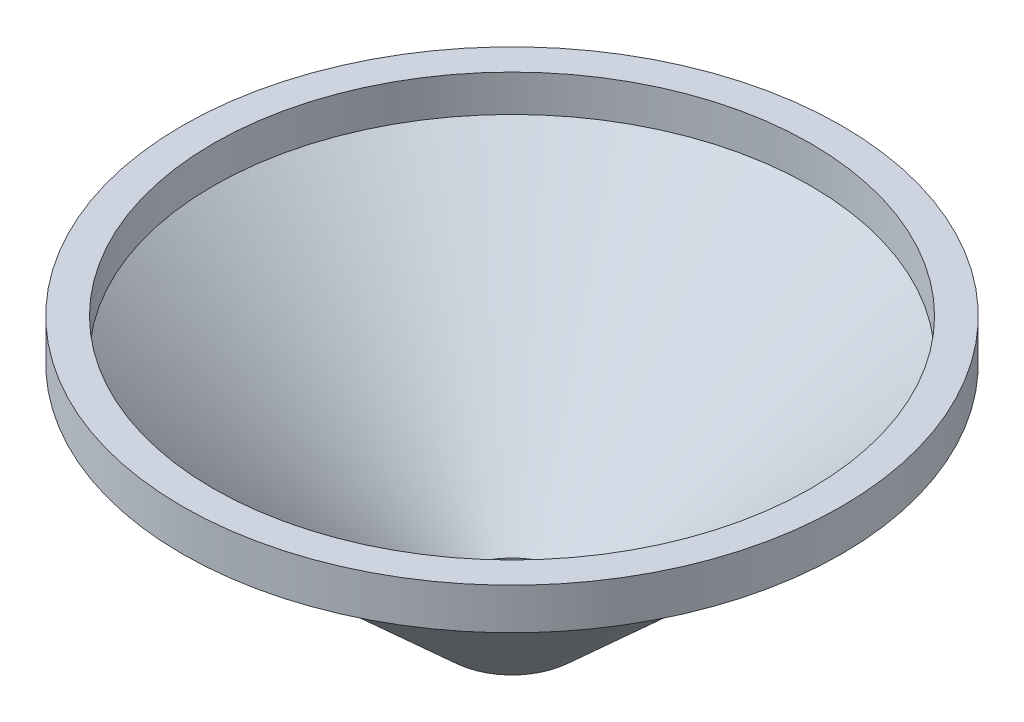
ISO-10303-21;
HEADER;
FILE_DESCRIPTION(('STEP AP214'),'2;1');
FILE_NAME('part.step','',(''),(''),'','','');
FILE_SCHEMA(('AUTOMOTIVE_DESIGN { 1 0 10303 214 1 1 1 1 }'));
ENDSEC;
DATA;
#1=APPLICATION_CONTEXT('core data for automotive mechanical design processes');
#2=APPLICATION_PROTOCOL_DEFINITION('international standard','automotive_design',2000,#1);
#3=PRODUCT_CONTEXT('',#1,'mechanical');
#4=PRODUCT('Part','Part','',(#3));
#5=PRODUCT_RELATED_PRODUCT_CATEGORY('part','',(#4));
#6=PRODUCT_DEFINITION_FORMATION('','',#4);
#7=PRODUCT_DEFINITION_CONTEXT('part definition',#1,'design');
#8=PRODUCT_DEFINITION('design','',#6,#7);
#9=PRODUCT_DEFINITION_SHAPE('','',#8);
#10=(LENGTH_UNIT() NAMED_UNIT(*) SI_UNIT(.MILLI.,.METRE.));
#11=(NAMED_UNIT(*) PLANE_ANGLE_UNIT() SI_UNIT($,.RADIAN.));
#12=(NAMED_UNIT(*) SI_UNIT($,.STERADIAN.) SOLID_ANGLE_UNIT());
#13=UNCERTAINTY_MEASURE_WITH_UNIT(LENGTH_MEASURE(1.E-05),#10,'distance_accuracy_value','');
#14=(GEOMETRIC_REPRESENTATION_CONTEXT(3) GLOBAL_UNCERTAINTY_ASSIGNED_CONTEXT((#13)) GLOBAL_UNIT_ASSIGNED_CONTEXT((#10,
#11,#12)) REPRESENTATION_CONTEXT('',''));
#15=CARTESIAN_POINT('',(0.,0.,0.));
#16=DIRECTION('',(0.,0.,1.));
#17=DIRECTION('',(1.,0.,0.));
#18=AXIS2_PLACEMENT_3D('',#15,#16,#17);
#19=CARTESIAN_POINT('',(14.5,0.,0.));
#20=DIRECTION('',(0.,1.,0.));
#21=DIRECTION('',(0.,0.,1.));
#22=AXIS2_PLACEMENT_3D('',#19,#20,#21);
#23=PLANE('',#22);
#24=CARTESIAN_POINT('',(0.,0.,0.));
#25=DIRECTION('',(0.,1.,0.));
#26=DIRECTION('',(0.,0.,1.));
#27=AXIS2_PLACEMENT_3D('',#24,#25,#26);
#28=CIRCLE('',#27,14.5);
#29=CARTESIAN_POINT('',(0.,0.,14.5));
#30=VERTEX_POINT('',#29);
#31=EDGE_CURVE('E41',#30,#30,#28,.T.);
#32=ORIENTED_EDGE('',*,*,#31,.F.);
#33=EDGE_LOOP('',(#32));
#34=FACE_BOUND('',#33,.T.);
#35=CARTESIAN_POINT('',(0.,0.,0.));
#36=DIRECTION('',(0.,1.,0.));
#37=DIRECTION('',(0.,0.,1.));
#38=AXIS2_PLACEMENT_3D('',#35,#36,#37);
#39=CIRCLE('',#38,16.);
#40=CARTESIAN_POINT('',(0.,0.,16.));
#41=VERTEX_POINT('',#40);
#42=EDGE_CURVE('E53',#41,#41,#39,.T.);
#43=ORIENTED_EDGE('',*,*,#42,.T.);
#44=EDGE_LOOP('',(#43));
#45=FACE_BOUND('',#44,.T.);
#46=ADVANCED_FACE('F33',(#34,#45),#23,.T.);
#47=CARTESIAN_POINT('',(0.,0.,0.));
#48=DIRECTION('',(0.,1.,0.));
#49=DIRECTION('',(0.,0.,1.));
#50=AXIS2_PLACEMENT_3D('',#47,#48,#49);
#51=CYLINDRICAL_SURFACE('',#50,14.5);
#52=CARTESIAN_POINT('',(0.,-1.7796105291498,0.));
#53=DIRECTION('',(0.,1.,0.));
#54=DIRECTION('',(0.,0.,1.));
#55=AXIS2_PLACEMENT_3D('',#52,#53,#54);
#56=CIRCLE('',#55,14.5);
#57=CARTESIAN_POINT('',(0.,-1.7796105291498,14.5));
#58=VERTEX_POINT('',#57);
#59=EDGE_CURVE('E45',#58,#58,#56,.T.);
#60=ORIENTED_EDGE('',*,*,#59,.F.);
#61=EDGE_LOOP('',(#60));
#62=FACE_BOUND('',#61,.T.);
#63=ORIENTED_EDGE('',*,*,#31,.T.);
#64=EDGE_LOOP('',(#63));
#65=FACE_BOUND('',#64,.T.);
#66=ADVANCED_FACE('F78',(#62,#65),#51,.F.);
#67=CARTESIAN_POINT('',(0.,-1.7796105291498,0.));
#68=DIRECTION('',(0.,1.,0.));
#69=DIRECTION('',(0.,0.,1.));
#70=AXIS2_PLACEMENT_3D('',#67,#68,#69);
#71=CONICAL_SURFACE('',#70,14.5,0.830318571532458);
#72=CARTESIAN_POINT('',(0.,-12.2902194260044,0.));
#73=DIRECTION('',(0.,1.,0.));
#74=DIRECTION('',(0.,0.,1.));
#75=AXIS2_PLACEMENT_3D('',#72,#73,#74);
#76=CIRCLE('',#75,3.);
#77=CARTESIAN_POINT('',(0.,-12.2902194260044,3.));
#78=VERTEX_POINT('',#77);
#79=EDGE_CURVE('E56',#78,#78,#76,.F.);
#80=CARTESIAN_POINT('',(0.,-12.2902194260044,3.));
#81=CARTESIAN_POINT('',(0.,-12.1807339166621,3.11979166666667));
#82=CARTESIAN_POINT('',(0.,-12.0712484073199,3.23958333333333));
#83=CARTESIAN_POINT('',(0.,-11.8522773886354,3.47916666666667));
#84=CARTESIAN_POINT('',(0.,-11.7427918792932,3.59895833333333));
#85=CARTESIAN_POINT('',(0.,-11.5238208606087,3.83854166666667));
#86=CARTESIAN_POINT('',(0.,-11.4143353512665,3.95833333333333));
#87=CARTESIAN_POINT('',(0.,-11.195364332582,4.19791666666667));
#88=CARTESIAN_POINT('',(0.,-11.0858788232398,4.31770833333333));
#89=CARTESIAN_POINT('',(0.,-10.8669078045553,4.55729166666667));
#90=CARTESIAN_POINT('',(0.,-10.7574222952131,4.67708333333333));
#91=CARTESIAN_POINT('',(0.,-10.5384512765286,4.91666666666667));
#92=CARTESIAN_POINT('',(0.,-10.4289657671864,5.03645833333333));
#93=CARTESIAN_POINT('',(0.,-10.2099947485019,5.27604166666667));
#94=CARTESIAN_POINT('',(0.,-10.1005092391597,5.39583333333333));
#95=CARTESIAN_POINT('',(0.,-9.88153822047519,5.63541666666667));
#96=CARTESIAN_POINT('',(0.,-9.77205271113296,5.75520833333333));
#97=CARTESIAN_POINT('',(0.,-9.55308169244849,5.99479166666667));
#98=CARTESIAN_POINT('',(0.,-9.44359618310625,6.11458333333333));
#99=CARTESIAN_POINT('',(0.,-9.22462516442178,6.35416666666667));
#100=CARTESIAN_POINT('',(0.,-9.11513965507955,6.47395833333333));
#101=CARTESIAN_POINT('',(0.,-8.89616863639508,6.71354166666667));
#102=CARTESIAN_POINT('',(0.,-8.78668312705284,6.83333333333333));
#103=CARTESIAN_POINT('',(0.,-8.56771210836837,7.07291666666667));
#104=CARTESIAN_POINT('',(0.,-8.45822659902614,7.19270833333333));
#105=CARTESIAN_POINT('',(0.,-8.23925558034167,7.43229166666667));
#106=CARTESIAN_POINT('',(0.,-8.12977007099943,7.55208333333333));
#107=CARTESIAN_POINT('',(0.,-7.91079905231496,7.79166666666667));
#108=CARTESIAN_POINT('',(0.,-7.80131354297273,7.91145833333333));
#109=CARTESIAN_POINT('',(0.,-7.58234252428826,8.15104166666667));
#110=CARTESIAN_POINT('',(0.,-7.47285701494602,8.27083333333333));
#111=CARTESIAN_POINT('',(0.,-7.25388599626155,8.51041666666667));
#112=CARTESIAN_POINT('',(0.,-7.14440048691932,8.63020833333333));
#113=CARTESIAN_POINT('',(0.,-6.92542946823485,8.86979166666667));
#114=CARTESIAN_POINT('',(0.,-6.81594395889261,8.98958333333333));
#115=CARTESIAN_POINT('',(0.,-6.59697294020814,9.22916666666667));
#116=CARTESIAN_POINT('',(0.,-6.4874874308659,9.34895833333333));
#117=CARTESIAN_POINT('',(0.,-6.26851641218144,9.58854166666667));
#118=CARTESIAN_POINT('',(0.,-6.1590309028392,9.70833333333333));
#119=CARTESIAN_POINT('',(0.,-5.94005988415473,9.94791666666667));
#120=CARTESIAN_POINT('',(0.,-5.83057437481249,10.0677083333333));
#121=CARTESIAN_POINT('',(0.,-5.61160335612802,10.3072916666667));
#122=CARTESIAN_POINT('',(0.,-5.50211784678579,10.4270833333333));
#123=CARTESIAN_POINT('',(0.,-5.28314682810132,10.6666666666667));
#124=CARTESIAN_POINT('',(0.,-5.17366131875908,10.7864583333333));
#125=CARTESIAN_POINT('',(0.,-4.95469030007461,11.0260416666667));
#126=CARTESIAN_POINT('',(0.,-4.84520479073238,11.1458333333333));
#127=CARTESIAN_POINT('',(0.,-4.62623377204791,11.3854166666667));
#128=CARTESIAN_POINT('',(0.,-4.51674826270567,11.5052083333333));
#129=CARTESIAN_POINT('',(0.,-4.2977772440212,11.7447916666667));
#130=CARTESIAN_POINT('',(0.,-4.18829173467897,11.8645833333333));
#131=CARTESIAN_POINT('',(0.,-3.9693207159945,12.1041666666667));
#132=CARTESIAN_POINT('',(0.,-3.85983520665226,12.2239583333333));
#133=CARTESIAN_POINT('',(0.,-3.64086418796779,12.4635416666667));
#134=CARTESIAN_POINT('',(0.,-3.53137867862556,12.5833333333333));
#135=CARTESIAN_POINT('',(0.,-3.31240765994109,12.8229166666667));
#136=CARTESIAN_POINT('',(0.,-3.20292215059885,12.9427083333333));
#137=CARTESIAN_POINT('',(0.,-2.98395113191438,13.1822916666667));
#138=CARTESIAN_POINT('',(0.,-2.87446562257215,13.3020833333333));
#139=CARTESIAN_POINT('',(0.,-2.65549460388768,13.5416666666667));
#140=CARTESIAN_POINT('',(0.,-2.54600909454544,13.6614583333333));
#141=CARTESIAN_POINT('',(0.,-2.32703807586097,13.9010416666667));
#142=CARTESIAN_POINT('',(0.,-2.21755256651874,14.0208333333333));
#143=CARTESIAN_POINT('',(0.,-1.99858154783427,14.2604166666667));
#144=CARTESIAN_POINT('',(0.,-1.88909603849203,14.3802083333333));
#145=CARTESIAN_POINT('',(0.,-1.7796105291498,14.5));
#146=B_SPLINE_CURVE_WITH_KNOTS('',3,(#80,#81,#82,#83,#84,#85,#86,#87,#88,#89,#90,#91,#92,#93,
#94,#95,#96,#97,#98,#99,#100,#101,#102,#103,#104,#105,#106,#107,#108,#109,#110,#111,#112,#113,
#114,#115,#116,#117,#118,#119,#120,#121,#122,#123,#124,#125,#126,#127,#128,#129,#130,#131,#132,
#133,#134,#135,#136,#137,#138,#139,#140,#141,#142,#143,#144,#145),.UNSPECIFIED.,.F.,.F.,(4,2,2,
2,2,2,2,2,2,2,2,2,2,2,2,2,2,2,2,2,2,2,2,2,2,2,2,2,2,2,2,2,4),(0.,0.486861460200289,
0.973722920400578,1.46058438060087,1.94744584080116,2.43430730100145,2.92116876120173,
3.40803022140202,3.89489168160231,4.3817531418026,4.86861460200289,5.35547606220318,
5.84233752240347,6.32919898260376,6.81606044280405,7.30292190300434,7.78978336320463,
8.27664482340492,8.76350628360521,9.2503677438055,9.73722920400578,10.2240906642061,
10.7109521244064,11.1978135846067,11.6846750448069,12.1715365050072,12.6583979652075,
13.1452594254078,13.6321208856081,14.1189823458084,14.6058438060087,15.092705266209,
15.5795667264093),.UNSPECIFIED.);
#147=EDGE_CURVE('BSEAM83',#78,#58,#146,.T.);
#148=ORIENTED_EDGE('',*,*,#79,.T.);
#149=ORIENTED_EDGE('',*,*,#59,.T.);
#150=ORIENTED_EDGE('',*,*,#147,.T.);
#151=ORIENTED_EDGE('',*,*,#147,.F.);
#152=EDGE_LOOP('',(#148,#150,#149,#151));
#153=FACE_BOUND('',#152,.T.);
#154=ADVANCED_FACE('F83',(#153),#71,.F.);
#155=CARTESIAN_POINT('',(-15.,-2.,0.));
#156=DIRECTION('',(0.,-1.,0.));
#157=DIRECTION('',(0.,0.,-1.));
#158=AXIS2_PLACEMENT_3D('',#155,#156,#157);
#159=PLANE('',#158);
#160=CARTESIAN_POINT('',(0.,-2.,0.));
#161=DIRECTION('',(0.,1.,0.));
#162=DIRECTION('',(0.,0.,1.));
#163=AXIS2_PLACEMENT_3D('',#160,#161,#162);
#164=CIRCLE('',#163,15.);
#165=CARTESIAN_POINT('',(0.,-2.,15.));
#166=VERTEX_POINT('',#165);
#167=EDGE_CURVE('E10',#166,#166,#164,.T.);
#168=ORIENTED_EDGE('',*,*,#167,.T.);
#169=EDGE_LOOP('',(#168));
#170=FACE_BOUND('',#169,.T.);
#171=CARTESIAN_POINT('',(0.,-2.,0.));
#172=DIRECTION('',(0.,1.,0.));
#173=DIRECTION('',(0.,0.,1.));
#174=AXIS2_PLACEMENT_3D('',#171,#172,#173);
#175=CIRCLE('',#174,16.);
#176=CARTESIAN_POINT('',(0.,-2.,16.));
#177=VERTEX_POINT('',#176);
#178=EDGE_CURVE('E50',#177,#177,#175,.T.);
#179=ORIENTED_EDGE('',*,*,#178,.F.);
#180=EDGE_LOOP('',(#179));
#181=FACE_BOUND('',#180,.T.);
#182=ADVANCED_FACE('F74',(#170,#181),#159,.T.);
#183=CARTESIAN_POINT('',(0.,0.,0.));
#184=DIRECTION('',(0.,1.,0.));
#185=DIRECTION('',(0.,0.,1.));
#186=AXIS2_PLACEMENT_3D('',#183,#184,#185);
#187=CYLINDRICAL_SURFACE('',#186,16.);
#188=ORIENTED_EDGE('',*,*,#178,.T.);
#189=EDGE_LOOP('',(#188));
#190=FACE_BOUND('',#189,.T.);
#191=ORIENTED_EDGE('',*,*,#42,.F.);
#192=EDGE_LOOP('',(#191));
#193=FACE_BOUND('',#192,.T.);
#194=ADVANCED_FACE('F68',(#190,#193),#187,.T.);
#195=CARTESIAN_POINT('',(0.,-2.,0.));
#196=DIRECTION('',(0.,1.,0.));
#197=DIRECTION('',(0.,0.,1.));
#198=AXIS2_PLACEMENT_3D('',#195,#196,#197);
#199=CONICAL_SURFACE('',#198,15.,0.830318571532458);
#200=CARTESIAN_POINT('',(0.,-12.96759189237,0.));
#201=DIRECTION('',(0.,1.,0.));
#202=DIRECTION('',(0.,0.,1.));
#203=AXIS2_PLACEMENT_3D('',#200,#201,#202);
#204=CIRCLE('',#203,3.);
#205=CARTESIAN_POINT('',(0.,-12.96759189237,3.));
#206=VERTEX_POINT('',#205);
#207=EDGE_CURVE('E37',#206,#206,#204,.F.);
#208=CARTESIAN_POINT('',(0.,-12.96759189237,3.));
#209=CARTESIAN_POINT('',(0.,-12.8533461434911,3.125));
#210=CARTESIAN_POINT('',(0.,-12.7391003946123,3.25));
#211=CARTESIAN_POINT('',(0.,-12.5106088968546,3.5));
#212=CARTESIAN_POINT('',(0.,-12.3963631479757,3.625));
#213=CARTESIAN_POINT('',(0.,-12.167871650218,3.875));
#214=CARTESIAN_POINT('',(0.,-12.0536259013391,4.));
#215=CARTESIAN_POINT('',(0.,-11.8251344035814,4.25));
#216=CARTESIAN_POINT('',(0.,-11.7108886547026,4.375));
#217=CARTESIAN_POINT('',(0.,-11.4823971569449,4.625));
#218=CARTESIAN_POINT('',(0.,-11.368151408066,4.75));
#219=CARTESIAN_POINT('',(0.,-11.1396599103083,5.));
#220=CARTESIAN_POINT('',(0.,-11.0254141614295,5.125));
#221=CARTESIAN_POINT('',(0.,-10.7969226636718,5.375));
#222=CARTESIAN_POINT('',(0.,-10.6826769147929,5.5));
#223=CARTESIAN_POINT('',(0.,-10.4541854170352,5.75));
#224=CARTESIAN_POINT('',(0.,-10.3399396681563,5.875));
#225=CARTESIAN_POINT('',(0.,-10.1114481703986,6.125));
#226=CARTESIAN_POINT('',(0.,-9.99720242151978,6.25));
#227=CARTESIAN_POINT('',(0.,-9.76871092376207,6.5));
#228=CARTESIAN_POINT('',(0.,-9.65446517488321,6.625));
#229=CARTESIAN_POINT('',(0.,-9.4259736771255,6.875));
#230=CARTESIAN_POINT('',(0.,-9.31172792824665,7.));
#231=CARTESIAN_POINT('',(0.,-9.08323643048895,7.25));
#232=CARTESIAN_POINT('',(0.,-8.96899068161009,7.375));
#233=CARTESIAN_POINT('',(0.,-8.74049918385238,7.625));
#234=CARTESIAN_POINT('',(0.,-8.62625343497353,7.75));
#235=CARTESIAN_POINT('',(0.,-8.39776193721582,8.));
#236=CARTESIAN_POINT('',(0.,-8.28351618833697,8.125));
#237=CARTESIAN_POINT('',(0.,-8.05502469057926,8.375));
#238=CARTESIAN_POINT('',(0.,-7.9407789417004,8.5));
#239=CARTESIAN_POINT('',(0.,-7.7122874439427,8.75));
#240=CARTESIAN_POINT('',(0.,-7.59804169506384,8.875));
#241=CARTESIAN_POINT('',(0.,-7.36955019730614,9.125));
#242=CARTESIAN_POINT('',(0.,-7.25530444842728,9.25));
#243=CARTESIAN_POINT('',(0.,-7.02681295066957,9.5));
#244=CARTESIAN_POINT('',(0.,-6.91256720179072,9.625));
#245=CARTESIAN_POINT('',(0.,-6.68407570403301,9.875));
#246=CARTESIAN_POINT('',(0.,-6.56982995515416,10.));
#247=CARTESIAN_POINT('',(0.,-6.34133845739645,10.25));
#248=CARTESIAN_POINT('',(0.,-6.2270927085176,10.375));
#249=CARTESIAN_POINT('',(0.,-5.99860121075989,10.625));
#250=CARTESIAN_POINT('',(0.,-5.88435546188103,10.75));
#251=CARTESIAN_POINT('',(0.,-5.65586396412333,11.));
#252=CARTESIAN_POINT('',(0.,-5.54161821524447,11.125));
#253=CARTESIAN_POINT('',(0.,-5.31312671748676,11.375));
#254=CARTESIAN_POINT('',(0.,-5.19888096860791,11.5));
#255=CARTESIAN_POINT('',(0.,-4.9703894708502,11.75));
#256=CARTESIAN_POINT('',(0.,-4.85614372197135,11.875));
#257=CARTESIAN_POINT('',(0.,-4.62765222421364,12.125));
#258=CARTESIAN_POINT('',(0.,-4.51340647533479,12.25));
#259=CARTESIAN_POINT('',(0.,-4.28491497757708,12.5));
#260=CARTESIAN_POINT('',(0.,-4.17066922869822,12.625));
#261=CARTESIAN_POINT('',(0.,-3.94217773094052,12.875));
#262=CARTESIAN_POINT('',(0.,-3.82793198206166,13.));
#263=CARTESIAN_POINT('',(0.,-3.59944048430396,13.25));
#264=CARTESIAN_POINT('',(0.,-3.4851947354251,13.375));
#265=CARTESIAN_POINT('',(0.,-3.25670323766739,13.625));
#266=CARTESIAN_POINT('',(0.,-3.14245748878854,13.75));
#267=CARTESIAN_POINT('',(0.,-2.91396599103083,14.));
#268=CARTESIAN_POINT('',(0.,-2.79972024215198,14.125));
#269=CARTESIAN_POINT('',(0.,-2.57122874439427,14.375));
#270=CARTESIAN_POINT('',(0.,-2.45698299551542,14.5));
#271=CARTESIAN_POINT('',(0.,-2.22849149775771,14.75));
#272=CARTESIAN_POINT('',(0.,-2.11424574887885,14.875));
#273=CARTESIAN_POINT('',(0.,-2.,15.));
#274=B_SPLINE_CURVE_WITH_KNOTS('',3,(#208,#209,#210,#211,#212,#213,#214,#215,#216,#217,#218,
#219,#220,#221,#222,#223,#224,#225,#226,#227,#228,#229,#230,#231,#232,#233,#234,#235,#236,#237,
#238,#239,#240,#241,#242,#243,#244,#245,#246,#247,#248,#249,#250,#251,#252,#253,#254,#255,#256,
#257,#258,#259,#260,#261,#262,#263,#264,#265,#266,#267,#268,#269,#270,#271,#272,#273),
.UNSPECIFIED.,.F.,.F.,(4,2,2,2,2,2,2,2,2,2,2,2,2,2,2,2,2,2,2,2,2,2,2,2,2,2,2,2,2,2,2,2,4),(0.,
0.508029349774213,1.01605869954843,1.52408804932264,2.03211739909686,2.54014674887107,
3.04817609864529,3.5562054484195,4.06423479819372,4.57226414796793,5.08029349774215,
5.58832284751636,6.09635219729058,6.60438154706479,7.11241089683901,7.62044024661322,
8.12846959638744,8.63649894616165,9.14452829593587,9.65255764571008,10.1605869954843,
10.6686163452585,11.1766456950327,11.6846750448069,12.1927043945812,12.7007337443554,
13.2087630941296,13.7167924439038,14.224821793678,14.7328511434522,15.2408804932264,
15.7489098430007,16.2569391927749),.UNSPECIFIED.);
#275=EDGE_CURVE('BSEAM35',#206,#166,#274,.T.);
#276=ORIENTED_EDGE('',*,*,#207,.F.);
#277=ORIENTED_EDGE('',*,*,#167,.F.);
#278=ORIENTED_EDGE('',*,*,#275,.T.);
#279=ORIENTED_EDGE('',*,*,#275,.F.);
#280=EDGE_LOOP('',(#276,#278,#277,#279));
#281=FACE_BOUND('',#280,.T.);
#282=ADVANCED_FACE('F35',(#281),#199,.T.);
#283=CARTESIAN_POINT('',(0.,-15.,0.));
#284=DIRECTION('',(0.,1.,0.));
#285=DIRECTION('',(0.,0.,1.));
#286=AXIS2_PLACEMENT_3D('',#283,#284,#285);
#287=CYLINDRICAL_SURFACE('',#286,3.);
#288=ORIENTED_EDGE('',*,*,#207,.T.);
#289=EDGE_LOOP('',(#288));
#290=FACE_BOUND('',#289,.T.);
#291=ORIENTED_EDGE('',*,*,#79,.F.);
#292=EDGE_LOOP('',(#291));
#293=FACE_BOUND('',#292,.T.);
#294=ADVANCED_FACE('F63',(#290,#293),#287,.F.);
#295=CLOSED_SHELL('',(#46,#66,#154,#182,#194,#282,#294));
#296=MANIFOLD_SOLID_BREP('B2',#295);
#297=ADVANCED_BREP_SHAPE_REPRESENTATION('',(#18,#296),#14);
#298=SHAPE_DEFINITION_REPRESENTATION(#9,#297);
ENDSEC;
END-ISO-10303-21;
